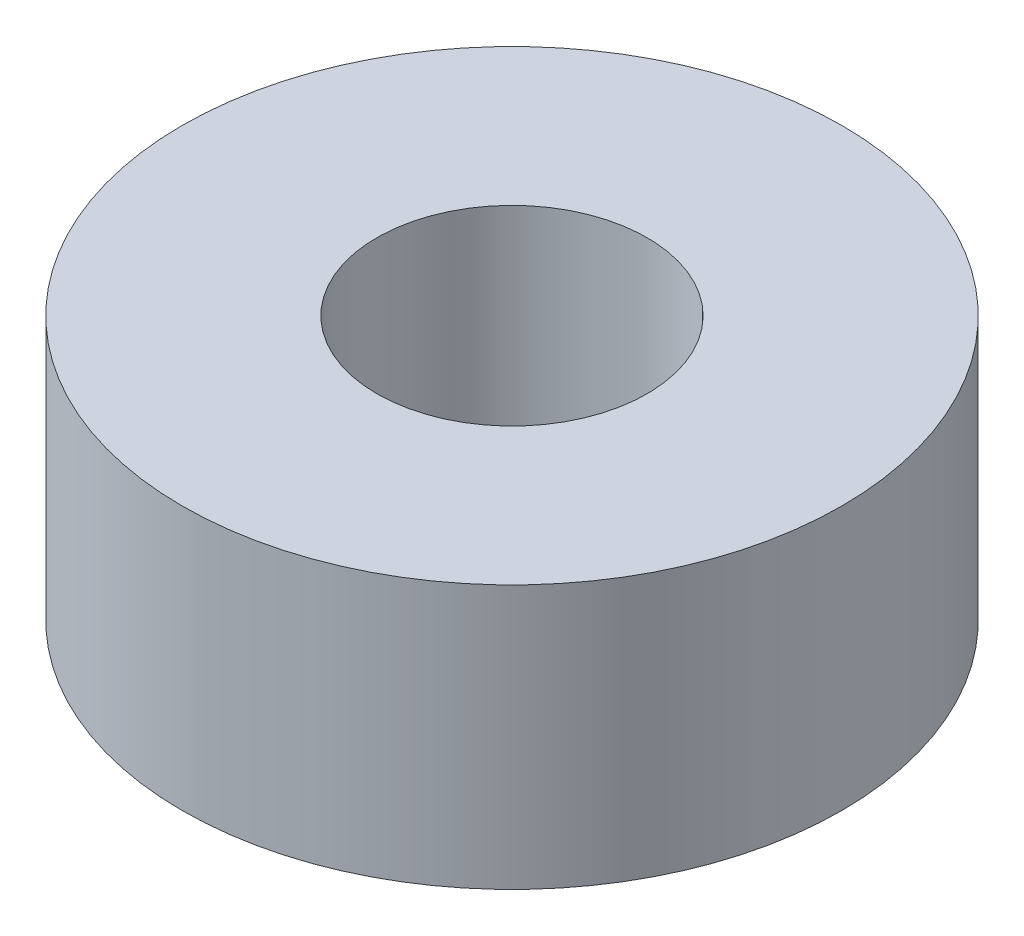
ISO-10303-21;
HEADER;
FILE_DESCRIPTION(('STEP AP214'),'2;1');
FILE_NAME('part.step','',(''),(''),'','','');
FILE_SCHEMA(('AUTOMOTIVE_DESIGN { 1 0 10303 214 1 1 1 1 }'));
ENDSEC;
DATA;
#1=APPLICATION_CONTEXT('core data for automotive mechanical design processes');
#2=APPLICATION_PROTOCOL_DEFINITION('international standard','automotive_design',2000,#1);
#3=PRODUCT_CONTEXT('',#1,'mechanical');
#4=PRODUCT('Part','Part','',(#3));
#5=PRODUCT_RELATED_PRODUCT_CATEGORY('part','',(#4));
#6=PRODUCT_DEFINITION_FORMATION('','',#4);
#7=PRODUCT_DEFINITION_CONTEXT('part definition',#1,'design');
#8=PRODUCT_DEFINITION('design','',#6,#7);
#9=PRODUCT_DEFINITION_SHAPE('','',#8);
#10=(LENGTH_UNIT() NAMED_UNIT(*) SI_UNIT(.MILLI.,.METRE.));
#11=(NAMED_UNIT(*) PLANE_ANGLE_UNIT() SI_UNIT($,.RADIAN.));
#12=(NAMED_UNIT(*) SI_UNIT($,.STERADIAN.) SOLID_ANGLE_UNIT());
#13=UNCERTAINTY_MEASURE_WITH_UNIT(LENGTH_MEASURE(1.E-05),#10,'distance_accuracy_value','');
#14=(GEOMETRIC_REPRESENTATION_CONTEXT(3) GLOBAL_UNCERTAINTY_ASSIGNED_CONTEXT((#13)) GLOBAL_UNIT_ASSIGNED_CONTEXT((#10,
#11,#12)) REPRESENTATION_CONTEXT('',''));
#15=CARTESIAN_POINT('',(0.,0.,0.));
#16=DIRECTION('',(0.,0.,1.));
#17=DIRECTION('',(1.,0.,0.));
#18=AXIS2_PLACEMENT_3D('',#15,#16,#17);
#19=CARTESIAN_POINT('',(0.,2.,0.));
#20=DIRECTION('',(0.,1.,0.));
#21=DIRECTION('',(0.,0.,1.));
#22=AXIS2_PLACEMENT_3D('',#19,#20,#21);
#23=PLANE('',#22);
#24=CARTESIAN_POINT('',(0.,2.,0.));
#25=DIRECTION('',(0.,1.,0.));
#26=DIRECTION('',(0.,0.,1.));
#27=AXIS2_PLACEMENT_3D('',#24,#25,#26);
#28=CIRCLE('',#27,5.);
#29=CARTESIAN_POINT('',(0.,2.,5.));
#30=VERTEX_POINT('',#29);
#31=EDGE_CURVE('E10',#30,#30,#28,.T.);
#32=ORIENTED_EDGE('',*,*,#31,.T.);
#33=EDGE_LOOP('',(#32));
#34=FACE_BOUND('',#33,.T.);
#35=CARTESIAN_POINT('',(0.,2.,0.));
#36=DIRECTION('',(0.,1.,0.));
#37=DIRECTION('',(0.,0.,1.));
#38=AXIS2_PLACEMENT_3D('',#35,#36,#37);
#39=CIRCLE('',#38,2.05);
#40=CARTESIAN_POINT('',(0.,2.,2.05));
#41=VERTEX_POINT('',#40);
#42=EDGE_CURVE('E43',#41,#41,#39,.T.);
#43=ORIENTED_EDGE('',*,*,#42,.F.);
#44=EDGE_LOOP('',(#43));
#45=FACE_BOUND('',#44,.T.);
#46=ADVANCED_FACE('F32',(#34,#45),#23,.T.);
#47=CARTESIAN_POINT('',(0.,-2.,0.));
#48=DIRECTION('',(0.,1.,0.));
#49=DIRECTION('',(0.,0.,1.));
#50=AXIS2_PLACEMENT_3D('',#47,#48,#49);
#51=PLANE('',#50);
#52=CARTESIAN_POINT('',(0.,-2.,0.));
#53=DIRECTION('',(0.,1.,0.));
#54=DIRECTION('',(0.,0.,1.));
#55=AXIS2_PLACEMENT_3D('',#52,#53,#54);
#56=CIRCLE('',#55,5.);
#57=CARTESIAN_POINT('',(0.,-2.,5.));
#58=VERTEX_POINT('',#57);
#59=EDGE_CURVE('E36',#58,#58,#56,.T.);
#60=ORIENTED_EDGE('',*,*,#59,.F.);
#61=EDGE_LOOP('',(#60));
#62=FACE_BOUND('',#61,.T.);
#63=CARTESIAN_POINT('',(0.,-2.,0.));
#64=DIRECTION('',(0.,1.,0.));
#65=DIRECTION('',(0.,0.,1.));
#66=AXIS2_PLACEMENT_3D('',#63,#64,#65);
#67=CIRCLE('',#66,2.05);
#68=CARTESIAN_POINT('',(0.,-2.,2.05));
#69=VERTEX_POINT('',#68);
#70=EDGE_CURVE('E45',#69,#69,#67,.T.);
#71=ORIENTED_EDGE('',*,*,#70,.T.);
#72=EDGE_LOOP('',(#71));
#73=FACE_BOUND('',#72,.T.);
#74=ADVANCED_FACE('F55',(#62,#73),#51,.F.);
#75=CARTESIAN_POINT('',(0.,2.,0.));
#76=DIRECTION('',(0.,-1.,0.));
#77=DIRECTION('',(0.,0.,-1.));
#78=AXIS2_PLACEMENT_3D('',#75,#76,#77);
#79=CYLINDRICAL_SURFACE('',#78,5.);
#80=ORIENTED_EDGE('',*,*,#31,.F.);
#81=EDGE_LOOP('',(#80));
#82=FACE_BOUND('',#81,.T.);
#83=ORIENTED_EDGE('',*,*,#59,.T.);
#84=EDGE_LOOP('',(#83));
#85=FACE_BOUND('',#84,.T.);
#86=ADVANCED_FACE('F34',(#82,#85),#79,.T.);
#87=CARTESIAN_POINT('',(0.,2.,0.));
#88=DIRECTION('',(0.,-1.,0.));
#89=DIRECTION('',(0.,0.,-1.));
#90=AXIS2_PLACEMENT_3D('',#87,#88,#89);
#91=CYLINDRICAL_SURFACE('',#90,2.05);
#92=ORIENTED_EDGE('',*,*,#42,.T.);
#93=EDGE_LOOP('',(#92));
#94=FACE_BOUND('',#93,.T.);
#95=ORIENTED_EDGE('',*,*,#70,.F.);
#96=EDGE_LOOP('',(#95));
#97=FACE_BOUND('',#96,.T.);
#98=ADVANCED_FACE('F51',(#94,#97),#91,.F.);
#99=CLOSED_SHELL('',(#46,#74,#86,#98));
#100=MANIFOLD_SOLID_BREP('B2',#99);
#101=ADVANCED_BREP_SHAPE_REPRESENTATION('',(#18,#100),#14);
#102=SHAPE_DEFINITION_REPRESENTATION(#9,#101);
ENDSEC;
END-ISO-10303-21;
